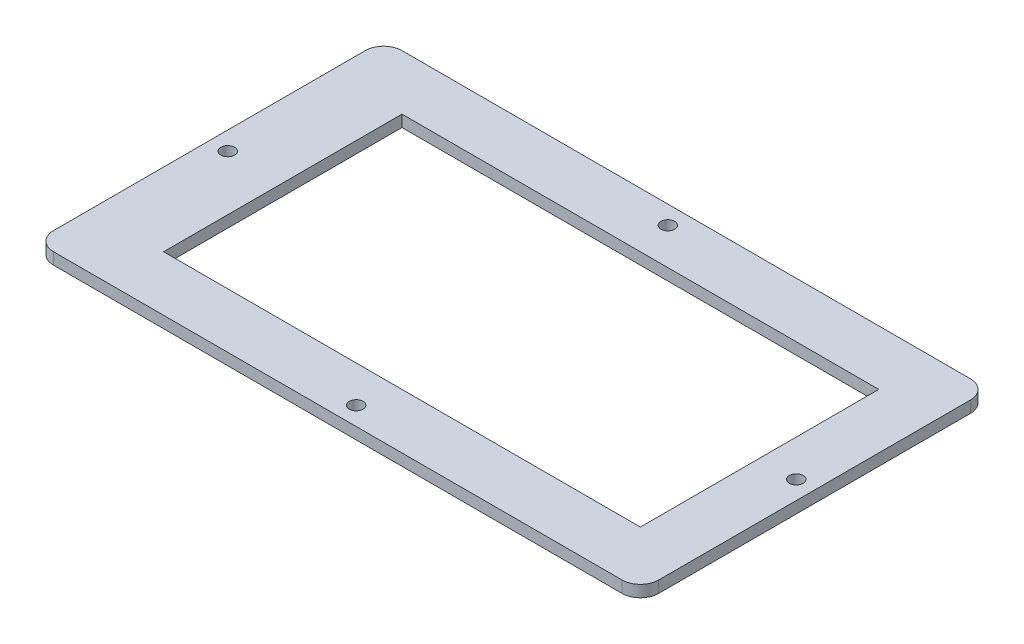
ISO-10303-21;
HEADER;
FILE_DESCRIPTION(('STEP AP214'),'2;1');
FILE_NAME('part.step','',(''),(''),'','','');
FILE_SCHEMA(('AUTOMOTIVE_DESIGN { 1 0 10303 214 1 1 1 1 }'));
ENDSEC;
DATA;
#1=APPLICATION_CONTEXT('core data for automotive mechanical design processes');
#2=APPLICATION_PROTOCOL_DEFINITION('international standard','automotive_design',2000,#1);
#3=PRODUCT_CONTEXT('',#1,'mechanical');
#4=PRODUCT('Part','Part','',(#3));
#5=PRODUCT_RELATED_PRODUCT_CATEGORY('part','',(#4));
#6=PRODUCT_DEFINITION_FORMATION('','',#4);
#7=PRODUCT_DEFINITION_CONTEXT('part definition',#1,'design');
#8=PRODUCT_DEFINITION('design','',#6,#7);
#9=PRODUCT_DEFINITION_SHAPE('','',#8);
#10=(LENGTH_UNIT() NAMED_UNIT(*) SI_UNIT(.MILLI.,.METRE.));
#11=(NAMED_UNIT(*) PLANE_ANGLE_UNIT() SI_UNIT($,.RADIAN.));
#12=(NAMED_UNIT(*) SI_UNIT($,.STERADIAN.) SOLID_ANGLE_UNIT());
#13=UNCERTAINTY_MEASURE_WITH_UNIT(LENGTH_MEASURE(1.E-05),#10,'distance_accuracy_value','');
#14=(GEOMETRIC_REPRESENTATION_CONTEXT(3) GLOBAL_UNCERTAINTY_ASSIGNED_CONTEXT((#13)) GLOBAL_UNIT_ASSIGNED_CONTEXT((#10,
#11,#12)) REPRESENTATION_CONTEXT('',''));
#15=CARTESIAN_POINT('',(0.,0.,0.));
#16=DIRECTION('',(0.,0.,1.));
#17=DIRECTION('',(1.,0.,0.));
#18=AXIS2_PLACEMENT_3D('',#15,#16,#17);
#19=CARTESIAN_POINT('',(-160.,3.175,-4.99999999999998));
#20=DIRECTION('',(0.,-1.,0.));
#21=DIRECTION('',(0.,0.,-1.));
#22=AXIS2_PLACEMENT_3D('',#19,#20,#21);
#23=PLANE('',#22);
#24=CARTESIAN_POINT('',(-5.,3.175,-47.5));
#25=DIRECTION('',(0.,1.,0.));
#26=DIRECTION('',(0.,0.,1.));
#27=AXIS2_PLACEMENT_3D('',#24,#25,#26);
#28=CIRCLE('',#27,1.875);
#29=CARTESIAN_POINT('',(-5.,3.175,-45.625));
#30=VERTEX_POINT('',#29);
#31=EDGE_CURVE('E161',#30,#30,#28,.T.);
#32=ORIENTED_EDGE('',*,*,#31,.F.);
#33=EDGE_LOOP('',(#32));
#34=FACE_BOUND('',#33,.T.);
#35=CARTESIAN_POINT('',(-160.,3.175,-47.5));
#36=DIRECTION('',(0.,1.,0.));
#37=DIRECTION('',(0.,0.,1.));
#38=AXIS2_PLACEMENT_3D('',#35,#36,#37);
#39=CIRCLE('',#38,1.87499999999999);
#40=CARTESIAN_POINT('',(-160.,3.175,-45.625));
#41=VERTEX_POINT('',#40);
#42=EDGE_CURVE('E167',#41,#41,#39,.T.);
#43=ORIENTED_EDGE('',*,*,#42,.F.);
#44=EDGE_LOOP('',(#43));
#45=FACE_BOUND('',#44,.T.);
#46=CARTESIAN_POINT('',(-160.,3.175,-4.99999999999998));
#47=DIRECTION('',(0.,1.,0.));
#48=DIRECTION('',(0.,0.,-1.));
#49=AXIS2_PLACEMENT_3D('',#46,#47,#48);
#50=CIRCLE('',#49,5.);
#51=CARTESIAN_POINT('',(-165.,3.175,-5.00000000000002));
#52=VERTEX_POINT('',#51);
#53=CARTESIAN_POINT('',(-160.,3.175,0.));
#54=VERTEX_POINT('',#53);
#55=EDGE_CURVE('E173',#52,#54,#50,.T.);
#56=ORIENTED_EDGE('',*,*,#55,.T.);
#57=DIRECTION('',(1.,0.,0.));
#58=VECTOR('',#57,1.);
#59=CARTESIAN_POINT('',(-5.00000000000004,3.175,0.));
#60=LINE('',#59,#58);
#61=CARTESIAN_POINT('',(-5.00000000000004,3.175,0.));
#62=VERTEX_POINT('',#61);
#63=EDGE_CURVE('E176',#54,#62,#60,.T.);
#64=ORIENTED_EDGE('',*,*,#63,.T.);
#65=CARTESIAN_POINT('',(-5.,3.175,-5.));
#66=DIRECTION('',(0.,1.,0.));
#67=DIRECTION('',(0.,0.,1.));
#68=AXIS2_PLACEMENT_3D('',#65,#66,#67);
#69=CIRCLE('',#68,5.);
#70=CARTESIAN_POINT('',(0.,3.175,-5.00000000000004));
#71=VERTEX_POINT('',#70);
#72=EDGE_CURVE('E179',#62,#71,#69,.T.);
#73=ORIENTED_EDGE('',*,*,#72,.T.);
#74=DIRECTION('',(0.,0.,-1.));
#75=VECTOR('',#74,1.);
#76=CARTESIAN_POINT('',(0.,3.175,-5.00000000000004));
#77=LINE('',#76,#75);
#78=CARTESIAN_POINT('',(0.,3.175,-90.));
#79=VERTEX_POINT('',#78);
#80=EDGE_CURVE('E181',#71,#79,#77,.T.);
#81=ORIENTED_EDGE('',*,*,#80,.T.);
#82=CARTESIAN_POINT('',(-5.,3.175,-90.));
#83=DIRECTION('',(0.,1.,0.));
#84=DIRECTION('',(0.,0.,1.));
#85=AXIS2_PLACEMENT_3D('',#82,#83,#84);
#86=CIRCLE('',#85,5.);
#87=CARTESIAN_POINT('',(-5.00000000000003,3.175,-95.));
#88=VERTEX_POINT('',#87);
#89=EDGE_CURVE('E183',#79,#88,#86,.T.);
#90=ORIENTED_EDGE('',*,*,#89,.T.);
#91=DIRECTION('',(-1.,0.,0.));
#92=VECTOR('',#91,1.);
#93=CARTESIAN_POINT('',(-5.00000000000004,3.175,-95.));
#94=LINE('',#93,#92);
#95=CARTESIAN_POINT('',(-160.,3.175,-95.));
#96=VERTEX_POINT('',#95);
#97=EDGE_CURVE('E185',#88,#96,#94,.T.);
#98=ORIENTED_EDGE('',*,*,#97,.T.);
#99=CARTESIAN_POINT('',(-160.,3.175,-90.));
#100=DIRECTION('',(0.,1.,0.));
#101=DIRECTION('',(0.,0.,1.));
#102=AXIS2_PLACEMENT_3D('',#99,#100,#101);
#103=CIRCLE('',#102,5.);
#104=CARTESIAN_POINT('',(-165.,3.175,-90.));
#105=VERTEX_POINT('',#104);
#106=EDGE_CURVE('E187',#96,#105,#103,.T.);
#107=ORIENTED_EDGE('',*,*,#106,.T.);
#108=DIRECTION('',(0.,0.,1.));
#109=VECTOR('',#108,1.);
#110=CARTESIAN_POINT('',(-165.,3.175,-5.00000000000002));
#111=LINE('',#110,#109);
#112=EDGE_CURVE('E189',#105,#52,#111,.T.);
#113=ORIENTED_EDGE('',*,*,#112,.T.);
#114=EDGE_LOOP('',(#56,#64,#73,#81,#90,#98,#107,#113));
#115=FACE_BOUND('',#114,.T.);
#116=DIRECTION('',(0.,0.,1.));
#117=VECTOR('',#116,1.);
#118=CARTESIAN_POINT('',(-145.,3.175,-80.));
#119=LINE('',#118,#117);
#120=CARTESIAN_POINT('',(-145.,3.175,-80.));
#121=VERTEX_POINT('',#120);
#122=CARTESIAN_POINT('',(-145.,3.175,-15.));
#123=VERTEX_POINT('',#122);
#124=EDGE_CURVE('E122',#121,#123,#119,.T.);
#125=ORIENTED_EDGE('',*,*,#124,.F.);
#126=DIRECTION('',(-1.,0.,0.));
#127=VECTOR('',#126,1.);
#128=CARTESIAN_POINT('',(-145.,3.175,-80.));
#129=LINE('',#128,#127);
#130=CARTESIAN_POINT('',(-15.,3.175,-80.));
#131=VERTEX_POINT('',#130);
#132=EDGE_CURVE('E145',#131,#121,#129,.T.);
#133=ORIENTED_EDGE('',*,*,#132,.F.);
#134=DIRECTION('',(0.,0.,-1.));
#135=VECTOR('',#134,1.);
#136=CARTESIAN_POINT('',(-15.,3.175,-80.));
#137=LINE('',#136,#135);
#138=CARTESIAN_POINT('',(-15.,3.175,-15.));
#139=VERTEX_POINT('',#138);
#140=EDGE_CURVE('E143',#139,#131,#137,.T.);
#141=ORIENTED_EDGE('',*,*,#140,.F.);
#142=DIRECTION('',(1.,0.,0.));
#143=VECTOR('',#142,1.);
#144=CARTESIAN_POINT('',(-145.,3.175,-15.));
#145=LINE('',#144,#143);
#146=EDGE_CURVE('E130',#123,#139,#145,.T.);
#147=ORIENTED_EDGE('',*,*,#146,.F.);
#148=EDGE_LOOP('',(#125,#133,#141,#147));
#149=FACE_BOUND('',#148,.T.);
#150=CARTESIAN_POINT('',(-82.5,3.175,-90.));
#151=DIRECTION('',(0.,1.,0.));
#152=DIRECTION('',(0.,0.,1.));
#153=AXIS2_PLACEMENT_3D('',#150,#151,#152);
#154=CIRCLE('',#153,1.875);
#155=CARTESIAN_POINT('',(-82.5,3.175,-88.125));
#156=VERTEX_POINT('',#155);
#157=EDGE_CURVE('E151',#156,#156,#154,.T.);
#158=ORIENTED_EDGE('',*,*,#157,.F.);
#159=EDGE_LOOP('',(#158));
#160=FACE_BOUND('',#159,.T.);
#161=CARTESIAN_POINT('',(-82.5,3.175,-5.));
#162=DIRECTION('',(0.,1.,0.));
#163=DIRECTION('',(0.,0.,1.));
#164=AXIS2_PLACEMENT_3D('',#161,#162,#163);
#165=CIRCLE('',#164,1.875);
#166=CARTESIAN_POINT('',(-82.5,3.175,-3.125));
#167=VERTEX_POINT('',#166);
#168=EDGE_CURVE('E328',#167,#167,#165,.T.);
#169=ORIENTED_EDGE('',*,*,#168,.F.);
#170=EDGE_LOOP('',(#169));
#171=FACE_BOUND('',#170,.T.);
#172=ADVANCED_FACE('F33',(#34,#45,#115,#149,#160,#171),#23,.F.);
#173=CARTESIAN_POINT('',(-160.,0.,-4.99999999999998));
#174=DIRECTION('',(0.,-1.,0.));
#175=DIRECTION('',(0.,0.,-1.));
#176=AXIS2_PLACEMENT_3D('',#173,#174,#175);
#177=PLANE('',#176);
#178=CARTESIAN_POINT('',(-82.5,0.,-90.));
#179=DIRECTION('',(0.,1.,0.));
#180=DIRECTION('',(0.,0.,1.));
#181=AXIS2_PLACEMENT_3D('',#178,#179,#180);
#182=CIRCLE('',#181,1.875);
#183=CARTESIAN_POINT('',(-82.5,0.,-88.125));
#184=VERTEX_POINT('',#183);
#185=EDGE_CURVE('E334',#184,#184,#182,.T.);
#186=ORIENTED_EDGE('',*,*,#185,.T.);
#187=EDGE_LOOP('',(#186));
#188=FACE_BOUND('',#187,.T.);
#189=CARTESIAN_POINT('',(-160.,0.,-47.5));
#190=DIRECTION('',(0.,1.,0.));
#191=DIRECTION('',(0.,0.,1.));
#192=AXIS2_PLACEMENT_3D('',#189,#190,#191);
#193=CIRCLE('',#192,1.87499999999999);
#194=CARTESIAN_POINT('',(-160.,0.,-45.625));
#195=VERTEX_POINT('',#194);
#196=EDGE_CURVE('E164',#195,#195,#193,.T.);
#197=ORIENTED_EDGE('',*,*,#196,.T.);
#198=EDGE_LOOP('',(#197));
#199=FACE_BOUND('',#198,.T.);
#200=CARTESIAN_POINT('',(-160.,0.,-4.99999999999998));
#201=DIRECTION('',(0.,1.,0.));
#202=DIRECTION('',(0.,0.,-1.));
#203=AXIS2_PLACEMENT_3D('',#200,#201,#202);
#204=CIRCLE('',#203,5.);
#205=CARTESIAN_POINT('',(-165.,0.,-5.00000000000002));
#206=VERTEX_POINT('',#205);
#207=CARTESIAN_POINT('',(-160.,0.,0.));
#208=VERTEX_POINT('',#207);
#209=EDGE_CURVE('E170',#206,#208,#204,.T.);
#210=ORIENTED_EDGE('',*,*,#209,.F.);
#211=DIRECTION('',(0.,0.,1.));
#212=VECTOR('',#211,1.);
#213=CARTESIAN_POINT('',(-165.,0.,-5.00000000000002));
#214=LINE('',#213,#212);
#215=CARTESIAN_POINT('',(-165.,0.,-90.));
#216=VERTEX_POINT('',#215);
#217=EDGE_CURVE('E177',#216,#206,#214,.T.);
#218=ORIENTED_EDGE('',*,*,#217,.F.);
#219=CARTESIAN_POINT('',(-160.,0.,-90.));
#220=DIRECTION('',(0.,1.,0.));
#221=DIRECTION('',(0.,0.,1.));
#222=AXIS2_PLACEMENT_3D('',#219,#220,#221);
#223=CIRCLE('',#222,5.);
#224=CARTESIAN_POINT('',(-160.,0.,-95.));
#225=VERTEX_POINT('',#224);
#226=EDGE_CURVE('E204',#225,#216,#223,.T.);
#227=ORIENTED_EDGE('',*,*,#226,.F.);
#228=DIRECTION('',(-1.,0.,0.));
#229=VECTOR('',#228,1.);
#230=CARTESIAN_POINT('',(-5.00000000000004,0.,-95.));
#231=LINE('',#230,#229);
#232=CARTESIAN_POINT('',(-5.00000000000003,0.,-95.));
#233=VERTEX_POINT('',#232);
#234=EDGE_CURVE('E202',#233,#225,#231,.T.);
#235=ORIENTED_EDGE('',*,*,#234,.F.);
#236=CARTESIAN_POINT('',(-5.,0.,-90.));
#237=DIRECTION('',(0.,1.,0.));
#238=DIRECTION('',(0.,0.,1.));
#239=AXIS2_PLACEMENT_3D('',#236,#237,#238);
#240=CIRCLE('',#239,5.);
#241=CARTESIAN_POINT('',(0.,0.,-90.));
#242=VERTEX_POINT('',#241);
#243=EDGE_CURVE('E200',#242,#233,#240,.T.);
#244=ORIENTED_EDGE('',*,*,#243,.F.);
#245=DIRECTION('',(0.,0.,-1.));
#246=VECTOR('',#245,1.);
#247=CARTESIAN_POINT('',(0.,0.,-5.00000000000004));
#248=LINE('',#247,#246);
#249=CARTESIAN_POINT('',(0.,0.,-5.00000000000004));
#250=VERTEX_POINT('',#249);
#251=EDGE_CURVE('E198',#250,#242,#248,.T.);
#252=ORIENTED_EDGE('',*,*,#251,.F.);
#253=CARTESIAN_POINT('',(-5.,0.,-5.));
#254=DIRECTION('',(0.,1.,0.));
#255=DIRECTION('',(0.,0.,1.));
#256=AXIS2_PLACEMENT_3D('',#253,#254,#255);
#257=CIRCLE('',#256,5.);
#258=CARTESIAN_POINT('',(-5.00000000000004,0.,0.));
#259=VERTEX_POINT('',#258);
#260=EDGE_CURVE('E196',#259,#250,#257,.T.);
#261=ORIENTED_EDGE('',*,*,#260,.F.);
#262=DIRECTION('',(1.,0.,0.));
#263=VECTOR('',#262,1.);
#264=CARTESIAN_POINT('',(-5.00000000000004,0.,0.));
#265=LINE('',#264,#263);
#266=EDGE_CURVE('E194',#208,#259,#265,.T.);
#267=ORIENTED_EDGE('',*,*,#266,.F.);
#268=EDGE_LOOP('',(#210,#218,#227,#235,#244,#252,#261,#267));
#269=FACE_BOUND('',#268,.T.);
#270=CARTESIAN_POINT('',(-5.,0.,-47.5));
#271=DIRECTION('',(0.,1.,0.));
#272=DIRECTION('',(0.,0.,1.));
#273=AXIS2_PLACEMENT_3D('',#270,#271,#272);
#274=CIRCLE('',#273,1.875);
#275=CARTESIAN_POINT('',(-5.,0.,-45.625));
#276=VERTEX_POINT('',#275);
#277=EDGE_CURVE('E138',#276,#276,#274,.T.);
#278=ORIENTED_EDGE('',*,*,#277,.T.);
#279=EDGE_LOOP('',(#278));
#280=FACE_BOUND('',#279,.T.);
#281=DIRECTION('',(-1.,0.,0.));
#282=VECTOR('',#281,1.);
#283=CARTESIAN_POINT('',(-145.,0.,-80.));
#284=LINE('',#283,#282);
#285=CARTESIAN_POINT('',(-15.,0.,-80.));
#286=VERTEX_POINT('',#285);
#287=CARTESIAN_POINT('',(-145.,0.,-80.));
#288=VERTEX_POINT('',#287);
#289=EDGE_CURVE('E131',#286,#288,#284,.T.);
#290=ORIENTED_EDGE('',*,*,#289,.T.);
#291=DIRECTION('',(0.,0.,1.));
#292=VECTOR('',#291,1.);
#293=CARTESIAN_POINT('',(-145.,0.,-80.));
#294=LINE('',#293,#292);
#295=CARTESIAN_POINT('',(-145.,0.,-15.));
#296=VERTEX_POINT('',#295);
#297=EDGE_CURVE('E56',#288,#296,#294,.T.);
#298=ORIENTED_EDGE('',*,*,#297,.T.);
#299=DIRECTION('',(1.,0.,0.));
#300=VECTOR('',#299,1.);
#301=CARTESIAN_POINT('',(-145.,0.,-15.));
#302=LINE('',#301,#300);
#303=CARTESIAN_POINT('',(-15.,0.,-15.));
#304=VERTEX_POINT('',#303);
#305=EDGE_CURVE('E137',#296,#304,#302,.T.);
#306=ORIENTED_EDGE('',*,*,#305,.T.);
#307=DIRECTION('',(0.,0.,-1.));
#308=VECTOR('',#307,1.);
#309=CARTESIAN_POINT('',(-15.,0.,-80.));
#310=LINE('',#309,#308);
#311=EDGE_CURVE('E153',#304,#286,#310,.T.);
#312=ORIENTED_EDGE('',*,*,#311,.T.);
#313=EDGE_LOOP('',(#290,#298,#306,#312));
#314=FACE_BOUND('',#313,.T.);
#315=CARTESIAN_POINT('',(-82.5,0.,-5.));
#316=DIRECTION('',(0.,1.,0.));
#317=DIRECTION('',(0.,0.,1.));
#318=AXIS2_PLACEMENT_3D('',#315,#316,#317);
#319=CIRCLE('',#318,1.875);
#320=CARTESIAN_POINT('',(-82.5,0.,-3.125));
#321=VERTEX_POINT('',#320);
#322=EDGE_CURVE('E331',#321,#321,#319,.T.);
#323=ORIENTED_EDGE('',*,*,#322,.T.);
#324=EDGE_LOOP('',(#323));
#325=FACE_BOUND('',#324,.T.);
#326=ADVANCED_FACE('F234',(#188,#199,#269,#280,#314,#325),#177,.T.);
#327=CARTESIAN_POINT('',(-160.,3.175,-4.99999999999998));
#328=DIRECTION('',(0.,-1.,0.));
#329=DIRECTION('',(0.,0.,-1.));
#330=AXIS2_PLACEMENT_3D('',#327,#328,#329);
#331=CYLINDRICAL_SURFACE('',#330,5.);
#332=ORIENTED_EDGE('',*,*,#209,.T.);
#333=DIRECTION('',(0.,-1.,0.));
#334=VECTOR('',#333,1.);
#335=CARTESIAN_POINT('',(-160.,3.175,0.));
#336=LINE('',#335,#334);
#337=EDGE_CURVE('E11',#54,#208,#336,.T.);
#338=ORIENTED_EDGE('',*,*,#337,.F.);
#339=ORIENTED_EDGE('',*,*,#55,.F.);
#340=DIRECTION('',(0.,-1.,0.));
#341=VECTOR('',#340,1.);
#342=CARTESIAN_POINT('',(-165.,3.175,-5.00000000000002));
#343=LINE('',#342,#341);
#344=EDGE_CURVE('E191',#52,#206,#343,.T.);
#345=ORIENTED_EDGE('',*,*,#344,.T.);
#346=EDGE_LOOP('',(#332,#338,#339,#345));
#347=FACE_BOUND('',#346,.T.);
#348=ADVANCED_FACE('F35',(#347),#331,.T.);
#349=CARTESIAN_POINT('',(-5.00000000000004,3.175,0.));
#350=DIRECTION('',(0.,0.,-1.));
#351=DIRECTION('',(-1.,0.,0.));
#352=AXIS2_PLACEMENT_3D('',#349,#350,#351);
#353=PLANE('',#352);
#354=ORIENTED_EDGE('',*,*,#266,.T.);
#355=DIRECTION('',(0.,-1.,0.));
#356=VECTOR('',#355,1.);
#357=CARTESIAN_POINT('',(-5.00000000000004,3.175,0.));
#358=LINE('',#357,#356);
#359=EDGE_CURVE('E41',#62,#259,#358,.T.);
#360=ORIENTED_EDGE('',*,*,#359,.F.);
#361=ORIENTED_EDGE('',*,*,#63,.F.);
#362=ORIENTED_EDGE('',*,*,#337,.T.);
#363=EDGE_LOOP('',(#354,#360,#361,#362));
#364=FACE_BOUND('',#363,.T.);
#365=ADVANCED_FACE('F251',(#364),#353,.F.);
#366=CARTESIAN_POINT('',(-5.,3.175,-5.));
#367=DIRECTION('',(0.,-1.,0.));
#368=DIRECTION('',(0.,0.,-1.));
#369=AXIS2_PLACEMENT_3D('',#366,#367,#368);
#370=CYLINDRICAL_SURFACE('',#369,5.);
#371=ORIENTED_EDGE('',*,*,#260,.T.);
#372=DIRECTION('',(0.,-1.,0.));
#373=VECTOR('',#372,1.);
#374=CARTESIAN_POINT('',(0.,3.175,-5.00000000000004));
#375=LINE('',#374,#373);
#376=EDGE_CURVE('E221',#71,#250,#375,.T.);
#377=ORIENTED_EDGE('',*,*,#376,.F.);
#378=ORIENTED_EDGE('',*,*,#72,.F.);
#379=ORIENTED_EDGE('',*,*,#359,.T.);
#380=EDGE_LOOP('',(#371,#377,#378,#379));
#381=FACE_BOUND('',#380,.T.);
#382=ADVANCED_FACE('F228',(#381),#370,.T.);
#383=CARTESIAN_POINT('',(0.,3.175,-5.00000000000004));
#384=DIRECTION('',(-1.,0.,0.));
#385=DIRECTION('',(0.,0.,1.));
#386=AXIS2_PLACEMENT_3D('',#383,#384,#385);
#387=PLANE('',#386);
#388=ORIENTED_EDGE('',*,*,#251,.T.);
#389=DIRECTION('',(0.,-1.,0.));
#390=VECTOR('',#389,1.);
#391=CARTESIAN_POINT('',(0.,3.175,-90.));
#392=LINE('',#391,#390);
#393=EDGE_CURVE('E218',#79,#242,#392,.T.);
#394=ORIENTED_EDGE('',*,*,#393,.F.);
#395=ORIENTED_EDGE('',*,*,#80,.F.);
#396=ORIENTED_EDGE('',*,*,#376,.T.);
#397=EDGE_LOOP('',(#388,#394,#395,#396));
#398=FACE_BOUND('',#397,.T.);
#399=ADVANCED_FACE('F240',(#398),#387,.F.);
#400=CARTESIAN_POINT('',(-5.,3.175,-90.));
#401=DIRECTION('',(0.,-1.,0.));
#402=DIRECTION('',(0.,0.,-1.));
#403=AXIS2_PLACEMENT_3D('',#400,#401,#402);
#404=CYLINDRICAL_SURFACE('',#403,5.);
#405=ORIENTED_EDGE('',*,*,#243,.T.);
#406=DIRECTION('',(0.,-1.,0.));
#407=VECTOR('',#406,1.);
#408=CARTESIAN_POINT('',(-5.00000000000003,3.175,-95.));
#409=LINE('',#408,#407);
#410=EDGE_CURVE('E215',#88,#233,#409,.T.);
#411=ORIENTED_EDGE('',*,*,#410,.F.);
#412=ORIENTED_EDGE('',*,*,#89,.F.);
#413=ORIENTED_EDGE('',*,*,#393,.T.);
#414=EDGE_LOOP('',(#405,#411,#412,#413));
#415=FACE_BOUND('',#414,.T.);
#416=ADVANCED_FACE('F244',(#415),#404,.T.);
#417=CARTESIAN_POINT('',(-5.00000000000004,3.175,-95.));
#418=DIRECTION('',(0.,0.,1.));
#419=DIRECTION('',(1.,0.,0.));
#420=AXIS2_PLACEMENT_3D('',#417,#418,#419);
#421=PLANE('',#420);
#422=ORIENTED_EDGE('',*,*,#234,.T.);
#423=DIRECTION('',(0.,-1.,0.));
#424=VECTOR('',#423,1.);
#425=CARTESIAN_POINT('',(-160.,3.175,-95.));
#426=LINE('',#425,#424);
#427=EDGE_CURVE('E212',#96,#225,#426,.T.);
#428=ORIENTED_EDGE('',*,*,#427,.F.);
#429=ORIENTED_EDGE('',*,*,#97,.F.);
#430=ORIENTED_EDGE('',*,*,#410,.T.);
#431=EDGE_LOOP('',(#422,#428,#429,#430));
#432=FACE_BOUND('',#431,.T.);
#433=ADVANCED_FACE('F264',(#432),#421,.F.);
#434=CARTESIAN_POINT('',(-160.,3.175,-90.));
#435=DIRECTION('',(0.,-1.,0.));
#436=DIRECTION('',(0.,0.,-1.));
#437=AXIS2_PLACEMENT_3D('',#434,#435,#436);
#438=CYLINDRICAL_SURFACE('',#437,5.);
#439=ORIENTED_EDGE('',*,*,#226,.T.);
#440=DIRECTION('',(0.,-1.,0.));
#441=VECTOR('',#440,1.);
#442=CARTESIAN_POINT('',(-165.,3.175,-90.));
#443=LINE('',#442,#441);
#444=EDGE_CURVE('E209',#105,#216,#443,.T.);
#445=ORIENTED_EDGE('',*,*,#444,.F.);
#446=ORIENTED_EDGE('',*,*,#106,.F.);
#447=ORIENTED_EDGE('',*,*,#427,.T.);
#448=EDGE_LOOP('',(#439,#445,#446,#447));
#449=FACE_BOUND('',#448,.T.);
#450=ADVANCED_FACE('F262',(#449),#438,.T.);
#451=CARTESIAN_POINT('',(-165.,3.175,-5.00000000000002));
#452=DIRECTION('',(1.,0.,0.));
#453=DIRECTION('',(0.,0.,-1.));
#454=AXIS2_PLACEMENT_3D('',#451,#452,#453);
#455=PLANE('',#454);
#456=ORIENTED_EDGE('',*,*,#217,.T.);
#457=ORIENTED_EDGE('',*,*,#344,.F.);
#458=ORIENTED_EDGE('',*,*,#112,.F.);
#459=ORIENTED_EDGE('',*,*,#444,.T.);
#460=EDGE_LOOP('',(#456,#457,#458,#459));
#461=FACE_BOUND('',#460,.T.);
#462=ADVANCED_FACE('F257',(#461),#455,.F.);
#463=CARTESIAN_POINT('',(-160.,3.175,-47.5));
#464=DIRECTION('',(0.,-1.,0.));
#465=DIRECTION('',(0.,0.,-1.));
#466=AXIS2_PLACEMENT_3D('',#463,#464,#465);
#467=CYLINDRICAL_SURFACE('',#466,1.87499999999999);
#468=ORIENTED_EDGE('',*,*,#42,.T.);
#469=EDGE_LOOP('',(#468));
#470=FACE_BOUND('',#469,.T.);
#471=ORIENTED_EDGE('',*,*,#196,.F.);
#472=EDGE_LOOP('',(#471));
#473=FACE_BOUND('',#472,.T.);
#474=ADVANCED_FACE('F284',(#470,#473),#467,.F.);
#475=CARTESIAN_POINT('',(-5.,3.175,-47.5));
#476=DIRECTION('',(0.,-1.,0.));
#477=DIRECTION('',(0.,0.,-1.));
#478=AXIS2_PLACEMENT_3D('',#475,#476,#477);
#479=CYLINDRICAL_SURFACE('',#478,1.875);
#480=ORIENTED_EDGE('',*,*,#31,.T.);
#481=EDGE_LOOP('',(#480));
#482=FACE_BOUND('',#481,.T.);
#483=ORIENTED_EDGE('',*,*,#277,.F.);
#484=EDGE_LOOP('',(#483));
#485=FACE_BOUND('',#484,.T.);
#486=ADVANCED_FACE('F291',(#482,#485),#479,.F.);
#487=CARTESIAN_POINT('',(-145.,3.175,-80.));
#488=DIRECTION('',(1.,0.,0.));
#489=DIRECTION('',(0.,0.,-1.));
#490=AXIS2_PLACEMENT_3D('',#487,#488,#489);
#491=PLANE('',#490);
#492=ORIENTED_EDGE('',*,*,#297,.F.);
#493=DIRECTION('',(0.,-1.,0.));
#494=VECTOR('',#493,1.);
#495=CARTESIAN_POINT('',(-145.,3.175,-80.));
#496=LINE('',#495,#494);
#497=EDGE_CURVE('E126',#121,#288,#496,.T.);
#498=ORIENTED_EDGE('',*,*,#497,.F.);
#499=ORIENTED_EDGE('',*,*,#124,.T.);
#500=DIRECTION('',(0.,-1.,0.));
#501=VECTOR('',#500,1.);
#502=CARTESIAN_POINT('',(-145.,3.175,-15.));
#503=LINE('',#502,#501);
#504=EDGE_CURVE('E125',#123,#296,#503,.T.);
#505=ORIENTED_EDGE('',*,*,#504,.T.);
#506=EDGE_LOOP('',(#492,#498,#499,#505));
#507=FACE_BOUND('',#506,.T.);
#508=ADVANCED_FACE('F124',(#507),#491,.T.);
#509=CARTESIAN_POINT('',(-145.,3.175,-15.));
#510=DIRECTION('',(0.,0.,-1.));
#511=DIRECTION('',(-1.,0.,0.));
#512=AXIS2_PLACEMENT_3D('',#509,#510,#511);
#513=PLANE('',#512);
#514=ORIENTED_EDGE('',*,*,#305,.F.);
#515=ORIENTED_EDGE('',*,*,#504,.F.);
#516=ORIENTED_EDGE('',*,*,#146,.T.);
#517=DIRECTION('',(0.,-1.,0.));
#518=VECTOR('',#517,1.);
#519=CARTESIAN_POINT('',(-15.,3.175,-15.));
#520=LINE('',#519,#518);
#521=EDGE_CURVE('E139',#139,#304,#520,.T.);
#522=ORIENTED_EDGE('',*,*,#521,.T.);
#523=EDGE_LOOP('',(#514,#515,#516,#522));
#524=FACE_BOUND('',#523,.T.);
#525=ADVANCED_FACE('F134',(#524),#513,.T.);
#526=CARTESIAN_POINT('',(-15.,3.175,-80.));
#527=DIRECTION('',(-1.,0.,0.));
#528=DIRECTION('',(0.,0.,1.));
#529=AXIS2_PLACEMENT_3D('',#526,#527,#528);
#530=PLANE('',#529);
#531=ORIENTED_EDGE('',*,*,#311,.F.);
#532=ORIENTED_EDGE('',*,*,#521,.F.);
#533=ORIENTED_EDGE('',*,*,#140,.T.);
#534=DIRECTION('',(0.,-1.,0.));
#535=VECTOR('',#534,1.);
#536=CARTESIAN_POINT('',(-15.,3.175,-80.));
#537=LINE('',#536,#535);
#538=EDGE_CURVE('E48',#131,#286,#537,.T.);
#539=ORIENTED_EDGE('',*,*,#538,.T.);
#540=EDGE_LOOP('',(#531,#532,#533,#539));
#541=FACE_BOUND('',#540,.T.);
#542=ADVANCED_FACE('F309',(#541),#530,.T.);
#543=CARTESIAN_POINT('',(-145.,3.175,-80.));
#544=DIRECTION('',(0.,0.,1.));
#545=DIRECTION('',(1.,0.,0.));
#546=AXIS2_PLACEMENT_3D('',#543,#544,#545);
#547=PLANE('',#546);
#548=ORIENTED_EDGE('',*,*,#289,.F.);
#549=ORIENTED_EDGE('',*,*,#538,.F.);
#550=ORIENTED_EDGE('',*,*,#132,.T.);
#551=ORIENTED_EDGE('',*,*,#497,.T.);
#552=EDGE_LOOP('',(#548,#549,#550,#551));
#553=FACE_BOUND('',#552,.T.);
#554=ADVANCED_FACE('F312',(#553),#547,.T.);
#555=CARTESIAN_POINT('',(-82.5,3.175,-90.));
#556=DIRECTION('',(0.,-1.,0.));
#557=DIRECTION('',(0.,0.,-1.));
#558=AXIS2_PLACEMENT_3D('',#555,#556,#557);
#559=CYLINDRICAL_SURFACE('',#558,1.875);
#560=ORIENTED_EDGE('',*,*,#157,.T.);
#561=EDGE_LOOP('',(#560));
#562=FACE_BOUND('',#561,.T.);
#563=ORIENTED_EDGE('',*,*,#185,.F.);
#564=EDGE_LOOP('',(#563));
#565=FACE_BOUND('',#564,.T.);
#566=ADVANCED_FACE('F316',(#562,#565),#559,.F.);
#567=CARTESIAN_POINT('',(-82.5,3.175,-5.));
#568=DIRECTION('',(0.,-1.,0.));
#569=DIRECTION('',(0.,0.,-1.));
#570=AXIS2_PLACEMENT_3D('',#567,#568,#569);
#571=CYLINDRICAL_SURFACE('',#570,1.875);
#572=ORIENTED_EDGE('',*,*,#168,.T.);
#573=EDGE_LOOP('',(#572));
#574=FACE_BOUND('',#573,.T.);
#575=ORIENTED_EDGE('',*,*,#322,.F.);
#576=EDGE_LOOP('',(#575));
#577=FACE_BOUND('',#576,.T.);
#578=ADVANCED_FACE('F319',(#574,#577),#571,.F.);
#579=CLOSED_SHELL('',(#172,#326,#348,#365,#382,#399,#416,#433,#450,#462,#474,#486,#508,#525,
#542,#554,#566,#578));
#580=MANIFOLD_SOLID_BREP('B2',#579);
#581=ADVANCED_BREP_SHAPE_REPRESENTATION('',(#18,#580),#14);
#582=SHAPE_DEFINITION_REPRESENTATION(#9,#581);
ENDSEC;
END-ISO-10303-21;
